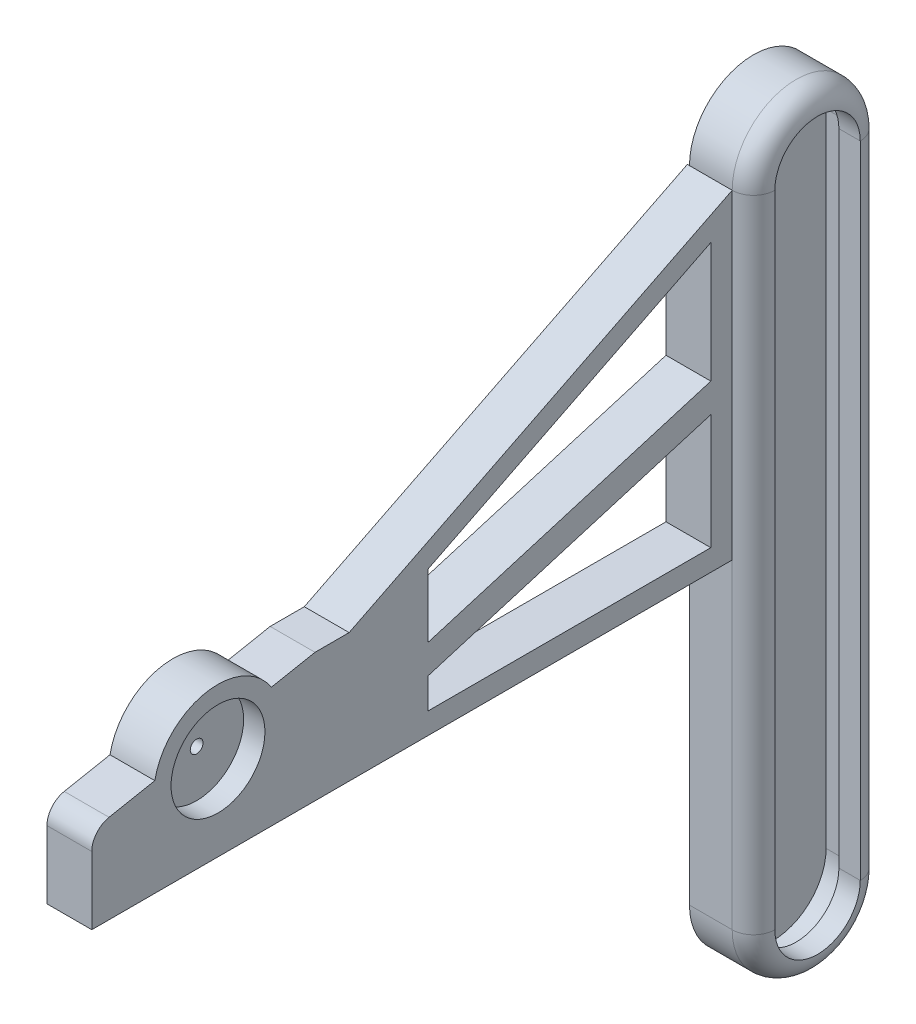
ISO-10303-21;
HEADER;
FILE_DESCRIPTION(('STEP AP214'),'2;1');
FILE_NAME('part.step','',(''),(''),'','','');
FILE_SCHEMA(('AUTOMOTIVE_DESIGN { 1 0 10303 214 1 1 1 1 }'));
ENDSEC;
DATA;
#1=APPLICATION_CONTEXT('core data for automotive mechanical design processes');
#2=APPLICATION_PROTOCOL_DEFINITION('international standard','automotive_design',2000,#1);
#3=PRODUCT_CONTEXT('',#1,'mechanical');
#4=PRODUCT('Part','Part','',(#3));
#5=PRODUCT_RELATED_PRODUCT_CATEGORY('part','',(#4));
#6=PRODUCT_DEFINITION_FORMATION('','',#4);
#7=PRODUCT_DEFINITION_CONTEXT('part definition',#1,'design');
#8=PRODUCT_DEFINITION('design','',#6,#7);
#9=PRODUCT_DEFINITION_SHAPE('','',#8);
#10=(LENGTH_UNIT() NAMED_UNIT(*) SI_UNIT(.MILLI.,.METRE.));
#11=(NAMED_UNIT(*) PLANE_ANGLE_UNIT() SI_UNIT($,.RADIAN.));
#12=(NAMED_UNIT(*) SI_UNIT($,.STERADIAN.) SOLID_ANGLE_UNIT());
#13=UNCERTAINTY_MEASURE_WITH_UNIT(LENGTH_MEASURE(1.E-05),#10,'distance_accuracy_value','');
#14=(GEOMETRIC_REPRESENTATION_CONTEXT(3) GLOBAL_UNCERTAINTY_ASSIGNED_CONTEXT((#13)) GLOBAL_UNIT_ASSIGNED_CONTEXT((#10,
#11,#12)) REPRESENTATION_CONTEXT('',''));
#15=CARTESIAN_POINT('',(0.,0.,0.));
#16=DIRECTION('',(0.,0.,1.));
#17=DIRECTION('',(1.,0.,0.));
#18=AXIS2_PLACEMENT_3D('',#15,#16,#17);
#19=CARTESIAN_POINT('',(20.,189.785242032039,270.87712185161));
#20=DIRECTION('',(-1.,0.,0.));
#21=DIRECTION('',(0.,0.,1.));
#22=AXIS2_PLACEMENT_3D('',#19,#20,#21);
#23=CYLINDRICAL_SURFACE('',#22,2.99999999999999);
#24=CARTESIAN_POINT('',(-0.999999999999987,189.785242032039,270.87712185161));
#25=DIRECTION('',(-1.,0.,0.));
#26=DIRECTION('',(0.,0.,1.));
#27=AXIS2_PLACEMENT_3D('',#24,#25,#26);
#28=CIRCLE('',#27,2.99999999999999);
#29=CARTESIAN_POINT('',(-0.999999999999987,189.785242032039,273.87712185161));
#30=VERTEX_POINT('',#29);
#31=EDGE_CURVE('E246',#30,#30,#28,.T.);
#32=ORIENTED_EDGE('',*,*,#31,.T.);
#33=EDGE_LOOP('',(#32));
#34=FACE_BOUND('',#33,.T.);
#35=CARTESIAN_POINT('',(9.99999999999996,189.785242032039,270.87712185161));
#36=DIRECTION('',(1.,0.,0.));
#37=DIRECTION('',(0.,0.,-1.));
#38=AXIS2_PLACEMENT_3D('',#35,#36,#37);
#39=CIRCLE('',#38,2.99999999999999);
#40=CARTESIAN_POINT('',(9.99999999999996,189.785242032039,267.87712185161));
#41=VERTEX_POINT('',#40);
#42=EDGE_CURVE('E47',#41,#41,#39,.F.);
#43=ORIENTED_EDGE('',*,*,#42,.F.);
#44=EDGE_LOOP('',(#43));
#45=FACE_BOUND('',#44,.T.);
#46=ADVANCED_FACE('F43',(#34,#45),#23,.F.);
#47=CARTESIAN_POINT('',(30.,300.,30.));
#48=DIRECTION('',(0.,0.,-1.));
#49=DIRECTION('',(0.,1.,0.));
#50=AXIS2_PLACEMENT_3D('',#47,#48,#49);
#51=PLANE('',#50);
#52=DIRECTION('',(1.,0.,0.));
#53=VECTOR('',#52,1.);
#54=CARTESIAN_POINT('',(-0.999999999999987,150.,30.));
#55=LINE('',#54,#53);
#56=CARTESIAN_POINT('',(0.,150.,30.));
#57=VERTEX_POINT('',#56);
#58=CARTESIAN_POINT('',(20.,150.,30.));
#59=VERTEX_POINT('',#58);
#60=EDGE_CURVE('E396',#57,#59,#55,.T.);
#61=ORIENTED_EDGE('',*,*,#60,.F.);
#62=DIRECTION('',(0.,-1.,0.));
#63=VECTOR('',#62,1.);
#64=CARTESIAN_POINT('',(0.,300.,30.));
#65=LINE('',#64,#63);
#66=CARTESIAN_POINT('',(0.,0.,30.));
#67=VERTEX_POINT('',#66);
#68=EDGE_CURVE('E497',#57,#67,#65,.T.);
#69=ORIENTED_EDGE('',*,*,#68,.T.);
#70=DIRECTION('',(-1.,0.,0.));
#71=VECTOR('',#70,1.);
#72=CARTESIAN_POINT('',(30.,0.,30.));
#73=LINE('',#72,#71);
#74=CARTESIAN_POINT('',(20.,0.,30.));
#75=VERTEX_POINT('',#74);
#76=EDGE_CURVE('E516',#75,#67,#73,.T.);
#77=ORIENTED_EDGE('',*,*,#76,.F.);
#78=DIRECTION('',(0.,-1.,0.));
#79=VECTOR('',#78,1.);
#80=CARTESIAN_POINT('',(20.,300.,30.));
#81=LINE('',#80,#79);
#82=EDGE_CURVE('E531',#75,#59,#81,.F.);
#83=ORIENTED_EDGE('',*,*,#82,.T.);
#84=EDGE_LOOP('',(#61,#69,#77,#83));
#85=FACE_BOUND('',#84,.T.);
#86=ADVANCED_FACE('F620',(#85),#51,.F.);
#87=CARTESIAN_POINT('',(30.,300.,0.));
#88=DIRECTION('',(-1.,0.,0.));
#89=DIRECTION('',(0.,0.,1.));
#90=AXIS2_PLACEMENT_3D('',#87,#88,#89);
#91=CYLINDRICAL_SURFACE('',#90,30.);
#92=DIRECTION('',(-1.,0.,0.));
#93=VECTOR('',#92,1.);
#94=CARTESIAN_POINT('',(30.,300.,30.));
#95=LINE('',#94,#93);
#96=CARTESIAN_POINT('',(20.,300.,30.));
#97=VERTEX_POINT('',#96);
#98=CARTESIAN_POINT('',(0.,300.,30.));
#99=VERTEX_POINT('',#98);
#100=EDGE_CURVE('E520',#97,#99,#95,.T.);
#101=ORIENTED_EDGE('',*,*,#100,.F.);
#102=CARTESIAN_POINT('',(20.,300.,0.));
#103=DIRECTION('',(1.,0.,0.));
#104=DIRECTION('',(0.,0.,-1.));
#105=AXIS2_PLACEMENT_3D('',#102,#103,#104);
#106=CIRCLE('',#105,30.);
#107=CARTESIAN_POINT('',(20.,300.,-30.));
#108=VERTEX_POINT('',#107);
#109=EDGE_CURVE('E538',#97,#108,#106,.F.);
#110=ORIENTED_EDGE('',*,*,#109,.T.);
#111=DIRECTION('',(-1.,0.,0.));
#112=VECTOR('',#111,1.);
#113=CARTESIAN_POINT('',(30.,300.,-30.));
#114=LINE('',#113,#112);
#115=CARTESIAN_POINT('',(0.,300.,-30.));
#116=VERTEX_POINT('',#115);
#117=EDGE_CURVE('E510',#108,#116,#114,.T.);
#118=ORIENTED_EDGE('',*,*,#117,.T.);
#119=CARTESIAN_POINT('',(0.,300.,0.));
#120=DIRECTION('',(1.,0.,0.));
#121=DIRECTION('',(0.,0.,-1.));
#122=AXIS2_PLACEMENT_3D('',#119,#120,#121);
#123=CIRCLE('',#122,30.);
#124=EDGE_CURVE('E493',#116,#99,#123,.T.);
#125=ORIENTED_EDGE('',*,*,#124,.T.);
#126=EDGE_LOOP('',(#101,#110,#118,#125));
#127=FACE_BOUND('',#126,.T.);
#128=ADVANCED_FACE('F589',(#127),#91,.T.);
#129=CARTESIAN_POINT('',(30.,0.,0.));
#130=DIRECTION('',(-1.,0.,0.));
#131=DIRECTION('',(0.,0.,1.));
#132=AXIS2_PLACEMENT_3D('',#129,#130,#131);
#133=CYLINDRICAL_SURFACE('',#132,30.);
#134=DIRECTION('',(-1.,0.,0.));
#135=VECTOR('',#134,1.);
#136=CARTESIAN_POINT('',(30.,0.,-30.));
#137=LINE('',#136,#135);
#138=CARTESIAN_POINT('',(20.,0.,-30.));
#139=VERTEX_POINT('',#138);
#140=CARTESIAN_POINT('',(0.,0.,-30.));
#141=VERTEX_POINT('',#140);
#142=EDGE_CURVE('E513',#139,#141,#137,.T.);
#143=ORIENTED_EDGE('',*,*,#142,.F.);
#144=CARTESIAN_POINT('',(20.,0.,0.));
#145=DIRECTION('',(1.,0.,0.));
#146=DIRECTION('',(0.,0.,-1.));
#147=AXIS2_PLACEMENT_3D('',#144,#145,#146);
#148=CIRCLE('',#147,30.);
#149=EDGE_CURVE('E527',#139,#75,#148,.F.);
#150=ORIENTED_EDGE('',*,*,#149,.T.);
#151=ORIENTED_EDGE('',*,*,#76,.T.);
#152=CARTESIAN_POINT('',(0.,0.,0.));
#153=DIRECTION('',(1.,0.,0.));
#154=DIRECTION('',(0.,0.,-1.));
#155=AXIS2_PLACEMENT_3D('',#152,#153,#154);
#156=CIRCLE('',#155,30.);
#157=EDGE_CURVE('E502',#67,#141,#156,.T.);
#158=ORIENTED_EDGE('',*,*,#157,.T.);
#159=EDGE_LOOP('',(#143,#150,#151,#158));
#160=FACE_BOUND('',#159,.T.);
#161=ADVANCED_FACE('F1035',(#160),#133,.T.);
#162=CARTESIAN_POINT('',(30.,0.,-30.));
#163=DIRECTION('',(0.,0.,1.));
#164=DIRECTION('',(0.,-1.,0.));
#165=AXIS2_PLACEMENT_3D('',#162,#163,#164);
#166=PLANE('',#165);
#167=ORIENTED_EDGE('',*,*,#117,.F.);
#168=DIRECTION('',(0.,1.,0.));
#169=VECTOR('',#168,1.);
#170=CARTESIAN_POINT('',(20.,0.,-30.));
#171=LINE('',#170,#169);
#172=EDGE_CURVE('E535',#108,#139,#171,.F.);
#173=ORIENTED_EDGE('',*,*,#172,.T.);
#174=ORIENTED_EDGE('',*,*,#142,.T.);
#175=DIRECTION('',(0.,1.,0.));
#176=VECTOR('',#175,1.);
#177=CARTESIAN_POINT('',(0.,0.,-30.));
#178=LINE('',#177,#176);
#179=EDGE_CURVE('E506',#141,#116,#178,.T.);
#180=ORIENTED_EDGE('',*,*,#179,.T.);
#181=EDGE_LOOP('',(#167,#173,#174,#180));
#182=FACE_BOUND('',#181,.T.);
#183=ADVANCED_FACE('F1025',(#182),#166,.F.);
#184=CARTESIAN_POINT('',(30.,0.,0.));
#185=DIRECTION('',(-1.,0.,0.));
#186=DIRECTION('',(0.,0.,1.));
#187=AXIS2_PLACEMENT_3D('',#184,#185,#186);
#188=CYLINDRICAL_SURFACE('',#187,20.);
#189=CARTESIAN_POINT('',(20.,0.,0.));
#190=DIRECTION('',(1.,0.,0.));
#191=DIRECTION('',(0.,0.,-1.));
#192=AXIS2_PLACEMENT_3D('',#189,#190,#191);
#193=CIRCLE('',#192,20.);
#194=CARTESIAN_POINT('',(20.,0.,20.));
#195=VERTEX_POINT('',#194);
#196=CARTESIAN_POINT('',(20.,0.,-20.));
#197=VERTEX_POINT('',#196);
#198=EDGE_CURVE('E460',#195,#197,#193,.T.);
#199=ORIENTED_EDGE('',*,*,#198,.F.);
#200=DIRECTION('',(-1.,0.,0.));
#201=VECTOR('',#200,1.);
#202=CARTESIAN_POINT('',(30.,0.,20.));
#203=LINE('',#202,#201);
#204=CARTESIAN_POINT('',(30.,0.,20.));
#205=VERTEX_POINT('',#204);
#206=EDGE_CURVE('E477',#205,#195,#203,.T.);
#207=ORIENTED_EDGE('',*,*,#206,.F.);
#208=CARTESIAN_POINT('',(30.,0.,0.));
#209=DIRECTION('',(1.,0.,0.));
#210=DIRECTION('',(0.,0.,-1.));
#211=AXIS2_PLACEMENT_3D('',#208,#209,#210);
#212=CIRCLE('',#211,20.);
#213=CARTESIAN_POINT('',(30.,0.,-20.));
#214=VERTEX_POINT('',#213);
#215=EDGE_CURVE('E463',#205,#214,#212,.T.);
#216=ORIENTED_EDGE('',*,*,#215,.T.);
#217=DIRECTION('',(-1.,0.,0.));
#218=VECTOR('',#217,1.);
#219=CARTESIAN_POINT('',(30.,0.,-20.));
#220=LINE('',#219,#218);
#221=EDGE_CURVE('E489',#214,#197,#220,.T.);
#222=ORIENTED_EDGE('',*,*,#221,.T.);
#223=EDGE_LOOP('',(#199,#207,#216,#222));
#224=FACE_BOUND('',#223,.T.);
#225=ADVANCED_FACE('F1015',(#224),#188,.F.);
#226=CARTESIAN_POINT('',(30.,300.,-20.));
#227=DIRECTION('',(0.,0.,1.));
#228=DIRECTION('',(0.,-1.,0.));
#229=AXIS2_PLACEMENT_3D('',#226,#227,#228);
#230=PLANE('',#229);
#231=DIRECTION('',(0.,1.,0.));
#232=VECTOR('',#231,1.);
#233=CARTESIAN_POINT('',(20.,300.,-20.));
#234=LINE('',#233,#232);
#235=CARTESIAN_POINT('',(20.,300.,-20.));
#236=VERTEX_POINT('',#235);
#237=EDGE_CURVE('E457',#197,#236,#234,.T.);
#238=ORIENTED_EDGE('',*,*,#237,.F.);
#239=ORIENTED_EDGE('',*,*,#221,.F.);
#240=DIRECTION('',(0.,1.,0.));
#241=VECTOR('',#240,1.);
#242=CARTESIAN_POINT('',(30.,300.,-20.));
#243=LINE('',#242,#241);
#244=CARTESIAN_POINT('',(30.,300.,-20.));
#245=VERTEX_POINT('',#244);
#246=EDGE_CURVE('E467',#214,#245,#243,.T.);
#247=ORIENTED_EDGE('',*,*,#246,.T.);
#248=DIRECTION('',(-1.,0.,0.));
#249=VECTOR('',#248,1.);
#250=CARTESIAN_POINT('',(30.,300.,-20.));
#251=LINE('',#250,#249);
#252=EDGE_CURVE('E485',#245,#236,#251,.T.);
#253=ORIENTED_EDGE('',*,*,#252,.T.);
#254=EDGE_LOOP('',(#238,#239,#247,#253));
#255=FACE_BOUND('',#254,.T.);
#256=ADVANCED_FACE('F1005',(#255),#230,.T.);
#257=CARTESIAN_POINT('',(30.,300.,0.));
#258=DIRECTION('',(-1.,0.,0.));
#259=DIRECTION('',(0.,0.,1.));
#260=AXIS2_PLACEMENT_3D('',#257,#258,#259);
#261=CYLINDRICAL_SURFACE('',#260,20.);
#262=CARTESIAN_POINT('',(20.,300.,0.));
#263=DIRECTION('',(1.,0.,0.));
#264=DIRECTION('',(0.,0.,-1.));
#265=AXIS2_PLACEMENT_3D('',#262,#263,#264);
#266=CIRCLE('',#265,20.);
#267=CARTESIAN_POINT('',(20.,300.,20.));
#268=VERTEX_POINT('',#267);
#269=EDGE_CURVE('E446',#236,#268,#266,.T.);
#270=ORIENTED_EDGE('',*,*,#269,.F.);
#271=ORIENTED_EDGE('',*,*,#252,.F.);
#272=CARTESIAN_POINT('',(30.,300.,0.));
#273=DIRECTION('',(1.,0.,0.));
#274=DIRECTION('',(0.,0.,-1.));
#275=AXIS2_PLACEMENT_3D('',#272,#273,#274);
#276=CIRCLE('',#275,20.);
#277=CARTESIAN_POINT('',(30.,300.,20.));
#278=VERTEX_POINT('',#277);
#279=EDGE_CURVE('E470',#245,#278,#276,.T.);
#280=ORIENTED_EDGE('',*,*,#279,.T.);
#281=DIRECTION('',(-1.,0.,0.));
#282=VECTOR('',#281,1.);
#283=CARTESIAN_POINT('',(30.,300.,20.));
#284=LINE('',#283,#282);
#285=EDGE_CURVE('E481',#278,#268,#284,.T.);
#286=ORIENTED_EDGE('',*,*,#285,.T.);
#287=EDGE_LOOP('',(#270,#271,#280,#286));
#288=FACE_BOUND('',#287,.T.);
#289=ADVANCED_FACE('F995',(#288),#261,.F.);
#290=CARTESIAN_POINT('',(30.,0.,20.));
#291=DIRECTION('',(0.,0.,-1.));
#292=DIRECTION('',(0.,1.,0.));
#293=AXIS2_PLACEMENT_3D('',#290,#291,#292);
#294=PLANE('',#293);
#295=DIRECTION('',(0.,-1.,0.));
#296=VECTOR('',#295,1.);
#297=CARTESIAN_POINT('',(20.,0.,20.));
#298=LINE('',#297,#296);
#299=EDGE_CURVE('E524',#268,#195,#298,.T.);
#300=ORIENTED_EDGE('',*,*,#299,.F.);
#301=ORIENTED_EDGE('',*,*,#285,.F.);
#302=DIRECTION('',(0.,-1.,0.));
#303=VECTOR('',#302,1.);
#304=CARTESIAN_POINT('',(30.,0.,20.));
#305=LINE('',#304,#303);
#306=EDGE_CURVE('E474',#278,#205,#305,.T.);
#307=ORIENTED_EDGE('',*,*,#306,.T.);
#308=ORIENTED_EDGE('',*,*,#206,.T.);
#309=EDGE_LOOP('',(#300,#301,#307,#308));
#310=FACE_BOUND('',#309,.T.);
#311=ADVANCED_FACE('F990',(#310),#294,.T.);
#312=CARTESIAN_POINT('',(0.,0.,0.));
#313=DIRECTION('',(1.,0.,0.));
#314=DIRECTION('',(0.,0.,-1.));
#315=AXIS2_PLACEMENT_3D('',#312,#313,#314);
#316=PLANE('',#315);
#317=ORIENTED_EDGE('',*,*,#124,.F.);
#318=ORIENTED_EDGE('',*,*,#179,.F.);
#319=ORIENTED_EDGE('',*,*,#157,.F.);
#320=ORIENTED_EDGE('',*,*,#68,.F.);
#321=EDGE_CURVE('E498',#99,#57,#65,.T.);
#322=ORIENTED_EDGE('',*,*,#321,.F.);
#323=EDGE_LOOP('',(#317,#318,#319,#320,#322));
#324=FACE_BOUND('',#323,.T.);
#325=ADVANCED_FACE('F584',(#324),#316,.F.);
#326=CARTESIAN_POINT('',(9.00000000000001,0.,0.));
#327=DIRECTION('',(1.,0.,0.));
#328=DIRECTION('',(0.,0.,-1.));
#329=AXIS2_PLACEMENT_3D('',#326,#327,#328);
#330=CYLINDRICAL_SURFACE('',#329,25.);
#331=DIRECTION('',(1.,0.,0.));
#332=VECTOR('',#331,1.);
#333=CARTESIAN_POINT('',(9.00000000000001,0.,-25.));
#334=LINE('',#333,#332);
#335=CARTESIAN_POINT('',(9.00000000000001,0.,-25.));
#336=VERTEX_POINT('',#335);
#337=CARTESIAN_POINT('',(20.,0.,-25.));
#338=VERTEX_POINT('',#337);
#339=EDGE_CURVE('E442',#336,#338,#334,.T.);
#340=ORIENTED_EDGE('',*,*,#339,.F.);
#341=CARTESIAN_POINT('',(9.00000000000001,0.,0.));
#342=DIRECTION('',(1.,0.,0.));
#343=DIRECTION('',(0.,0.,-1.));
#344=AXIS2_PLACEMENT_3D('',#341,#342,#343);
#345=CIRCLE('',#344,25.);
#346=CARTESIAN_POINT('',(9.00000000000001,0.,25.));
#347=VERTEX_POINT('',#346);
#348=EDGE_CURVE('E426',#347,#336,#345,.T.);
#349=ORIENTED_EDGE('',*,*,#348,.F.);
#350=DIRECTION('',(1.,0.,0.));
#351=VECTOR('',#350,1.);
#352=CARTESIAN_POINT('',(9.00000000000001,0.,25.));
#353=LINE('',#352,#351);
#354=CARTESIAN_POINT('',(20.,0.,25.));
#355=VERTEX_POINT('',#354);
#356=EDGE_CURVE('E443',#347,#355,#353,.T.);
#357=ORIENTED_EDGE('',*,*,#356,.T.);
#358=CARTESIAN_POINT('',(20.,0.,0.));
#359=DIRECTION('',(1.,0.,0.));
#360=DIRECTION('',(0.,0.,-1.));
#361=AXIS2_PLACEMENT_3D('',#358,#359,#360);
#362=CIRCLE('',#361,25.);
#363=EDGE_CURVE('E409',#355,#338,#362,.T.);
#364=ORIENTED_EDGE('',*,*,#363,.T.);
#365=EDGE_LOOP('',(#340,#349,#357,#364));
#366=FACE_BOUND('',#365,.T.);
#367=ADVANCED_FACE('F974',(#366),#330,.F.);
#368=CARTESIAN_POINT('',(9.00000000000001,0.,25.));
#369=DIRECTION('',(0.,0.,1.));
#370=DIRECTION('',(0.,-1.,0.));
#371=AXIS2_PLACEMENT_3D('',#368,#369,#370);
#372=PLANE('',#371);
#373=ORIENTED_EDGE('',*,*,#356,.F.);
#374=DIRECTION('',(0.,-1.,0.));
#375=VECTOR('',#374,1.);
#376=CARTESIAN_POINT('',(9.00000000000001,0.,25.));
#377=LINE('',#376,#375);
#378=CARTESIAN_POINT('',(9.00000000000001,300.,25.));
#379=VERTEX_POINT('',#378);
#380=EDGE_CURVE('E438',#379,#347,#377,.T.);
#381=ORIENTED_EDGE('',*,*,#380,.F.);
#382=DIRECTION('',(1.,0.,0.));
#383=VECTOR('',#382,1.);
#384=CARTESIAN_POINT('',(9.00000000000001,300.,25.));
#385=LINE('',#384,#383);
#386=CARTESIAN_POINT('',(20.,300.,25.));
#387=VERTEX_POINT('',#386);
#388=EDGE_CURVE('E447',#379,#387,#385,.T.);
#389=ORIENTED_EDGE('',*,*,#388,.T.);
#390=DIRECTION('',(0.,-1.,0.));
#391=VECTOR('',#390,1.);
#392=CARTESIAN_POINT('',(20.,0.,25.));
#393=LINE('',#392,#391);
#394=EDGE_CURVE('E422',#387,#355,#393,.T.);
#395=ORIENTED_EDGE('',*,*,#394,.T.);
#396=EDGE_LOOP('',(#373,#381,#389,#395));
#397=FACE_BOUND('',#396,.T.);
#398=ADVANCED_FACE('F964',(#397),#372,.F.);
#399=CARTESIAN_POINT('',(9.00000000000001,300.,0.));
#400=DIRECTION('',(1.,0.,0.));
#401=DIRECTION('',(0.,0.,-1.));
#402=AXIS2_PLACEMENT_3D('',#399,#400,#401);
#403=CYLINDRICAL_SURFACE('',#402,25.);
#404=ORIENTED_EDGE('',*,*,#388,.F.);
#405=CARTESIAN_POINT('',(9.00000000000001,300.,0.));
#406=DIRECTION('',(1.,0.,0.));
#407=DIRECTION('',(0.,0.,-1.));
#408=AXIS2_PLACEMENT_3D('',#405,#406,#407);
#409=CIRCLE('',#408,25.);
#410=CARTESIAN_POINT('',(9.00000000000001,300.,-25.));
#411=VERTEX_POINT('',#410);
#412=EDGE_CURVE('E434',#411,#379,#409,.T.);
#413=ORIENTED_EDGE('',*,*,#412,.F.);
#414=DIRECTION('',(1.,0.,0.));
#415=VECTOR('',#414,1.);
#416=CARTESIAN_POINT('',(9.00000000000001,300.,-25.));
#417=LINE('',#416,#415);
#418=CARTESIAN_POINT('',(20.,300.,-25.));
#419=VERTEX_POINT('',#418);
#420=EDGE_CURVE('E450',#411,#419,#417,.T.);
#421=ORIENTED_EDGE('',*,*,#420,.T.);
#422=CARTESIAN_POINT('',(20.,300.,0.));
#423=DIRECTION('',(1.,0.,0.));
#424=DIRECTION('',(0.,0.,-1.));
#425=AXIS2_PLACEMENT_3D('',#422,#423,#424);
#426=CIRCLE('',#425,25.);
#427=EDGE_CURVE('E418',#419,#387,#426,.T.);
#428=ORIENTED_EDGE('',*,*,#427,.T.);
#429=EDGE_LOOP('',(#404,#413,#421,#428));
#430=FACE_BOUND('',#429,.T.);
#431=ADVANCED_FACE('F954',(#430),#403,.F.);
#432=CARTESIAN_POINT('',(9.00000000000001,300.,-25.));
#433=DIRECTION('',(0.,0.,-1.));
#434=DIRECTION('',(0.,1.,0.));
#435=AXIS2_PLACEMENT_3D('',#432,#433,#434);
#436=PLANE('',#435);
#437=ORIENTED_EDGE('',*,*,#420,.F.);
#438=DIRECTION('',(0.,1.,0.));
#439=VECTOR('',#438,1.);
#440=CARTESIAN_POINT('',(9.00000000000001,300.,-25.));
#441=LINE('',#440,#439);
#442=EDGE_CURVE('E430',#336,#411,#441,.T.);
#443=ORIENTED_EDGE('',*,*,#442,.F.);
#444=ORIENTED_EDGE('',*,*,#339,.T.);
#445=DIRECTION('',(0.,1.,0.));
#446=VECTOR('',#445,1.);
#447=CARTESIAN_POINT('',(20.,300.,-25.));
#448=LINE('',#447,#446);
#449=EDGE_CURVE('E413',#338,#419,#448,.T.);
#450=ORIENTED_EDGE('',*,*,#449,.T.);
#451=EDGE_LOOP('',(#437,#443,#444,#450));
#452=FACE_BOUND('',#451,.T.);
#453=ADVANCED_FACE('F944',(#452),#436,.F.);
#454=CARTESIAN_POINT('',(9.00000000000001,0.,0.));
#455=DIRECTION('',(1.,0.,0.));
#456=DIRECTION('',(0.,0.,-1.));
#457=AXIS2_PLACEMENT_3D('',#454,#455,#456);
#458=PLANE('',#457);
#459=ORIENTED_EDGE('',*,*,#348,.T.);
#460=ORIENTED_EDGE('',*,*,#442,.T.);
#461=ORIENTED_EDGE('',*,*,#412,.T.);
#462=ORIENTED_EDGE('',*,*,#380,.T.);
#463=EDGE_LOOP('',(#459,#460,#461,#462));
#464=FACE_BOUND('',#463,.T.);
#465=ADVANCED_FACE('F934',(#464),#458,.T.);
#466=CARTESIAN_POINT('',(20.,0.,0.));
#467=DIRECTION('',(1.,0.,0.));
#468=DIRECTION('',(0.,0.,-1.));
#469=AXIS2_PLACEMENT_3D('',#466,#467,#468);
#470=PLANE('',#469);
#471=ORIENTED_EDGE('',*,*,#198,.T.);
#472=ORIENTED_EDGE('',*,*,#237,.T.);
#473=ORIENTED_EDGE('',*,*,#269,.T.);
#474=ORIENTED_EDGE('',*,*,#299,.T.);
#475=EDGE_LOOP('',(#471,#472,#473,#474));
#476=FACE_BOUND('',#475,.T.);
#477=ORIENTED_EDGE('',*,*,#363,.F.);
#478=ORIENTED_EDGE('',*,*,#394,.F.);
#479=ORIENTED_EDGE('',*,*,#427,.F.);
#480=ORIENTED_EDGE('',*,*,#449,.F.);
#481=EDGE_LOOP('',(#477,#478,#479,#480));
#482=FACE_BOUND('',#481,.T.);
#483=ADVANCED_FACE('F925',(#476,#482),#470,.F.);
#484=CARTESIAN_POINT('',(20.,300.,0.));
#485=DIRECTION('',(1.,0.,0.));
#486=DIRECTION('',(0.,0.,-1.));
#487=AXIS2_PLACEMENT_3D('',#484,#485,#486);
#488=TOROIDAL_SURFACE('',#487,20.,10.);
#489=CARTESIAN_POINT('',(20.,300.,-20.));
#490=DIRECTION('',(0.,-1.,0.));
#491=DIRECTION('',(0.,0.,-1.));
#492=AXIS2_PLACEMENT_3D('',#489,#490,#491);
#493=CIRCLE('',#492,10.);
#494=EDGE_CURVE('E547',#108,#245,#493,.T.);
#495=ORIENTED_EDGE('',*,*,#494,.F.);
#496=ORIENTED_EDGE('',*,*,#109,.F.);
#497=CARTESIAN_POINT('',(20.,300.,20.));
#498=DIRECTION('',(0.,-1.,0.));
#499=DIRECTION('',(0.,0.,-1.));
#500=AXIS2_PLACEMENT_3D('',#497,#498,#499);
#501=CIRCLE('',#500,10.);
#502=EDGE_CURVE('E414',#278,#97,#501,.T.);
#503=ORIENTED_EDGE('',*,*,#502,.F.);
#504=ORIENTED_EDGE('',*,*,#279,.F.);
#505=EDGE_LOOP('',(#495,#496,#503,#504));
#506=FACE_BOUND('',#505,.T.);
#507=ADVANCED_FACE('F915',(#506),#488,.T.);
#508=CARTESIAN_POINT('',(20.,300.,20.));
#509=DIRECTION('',(0.,1.,0.));
#510=DIRECTION('',(0.,0.,1.));
#511=AXIS2_PLACEMENT_3D('',#508,#509,#510);
#512=CYLINDRICAL_SURFACE('',#511,10.);
#513=ORIENTED_EDGE('',*,*,#502,.T.);
#514=DIRECTION('',(0.,-1.,0.));
#515=VECTOR('',#514,1.);
#516=CARTESIAN_POINT('',(20.,300.,30.));
#517=LINE('',#516,#515);
#518=EDGE_CURVE('E378',#97,#59,#517,.T.);
#519=ORIENTED_EDGE('',*,*,#518,.T.);
#520=ORIENTED_EDGE('',*,*,#82,.F.);
#521=CARTESIAN_POINT('',(20.,0.,20.));
#522=DIRECTION('',(0.,-1.,0.));
#523=DIRECTION('',(0.,0.,-1.));
#524=AXIS2_PLACEMENT_3D('',#521,#522,#523);
#525=CIRCLE('',#524,10.);
#526=EDGE_CURVE('E544',#205,#75,#525,.T.);
#527=ORIENTED_EDGE('',*,*,#526,.F.);
#528=ORIENTED_EDGE('',*,*,#306,.F.);
#529=EDGE_LOOP('',(#513,#519,#520,#527,#528));
#530=FACE_BOUND('',#529,.T.);
#531=ADVANCED_FACE('F905',(#530),#512,.T.);
#532=CARTESIAN_POINT('',(20.,300.,-20.));
#533=DIRECTION('',(0.,-1.,0.));
#534=DIRECTION('',(0.,0.,-1.));
#535=AXIS2_PLACEMENT_3D('',#532,#533,#534);
#536=CYLINDRICAL_SURFACE('',#535,10.);
#537=ORIENTED_EDGE('',*,*,#494,.T.);
#538=ORIENTED_EDGE('',*,*,#246,.F.);
#539=CARTESIAN_POINT('',(20.,0.,-20.));
#540=DIRECTION('',(0.,-1.,0.));
#541=DIRECTION('',(0.,0.,-1.));
#542=AXIS2_PLACEMENT_3D('',#539,#540,#541);
#543=CIRCLE('',#542,10.);
#544=EDGE_CURVE('E387',#139,#214,#543,.T.);
#545=ORIENTED_EDGE('',*,*,#544,.F.);
#546=ORIENTED_EDGE('',*,*,#172,.F.);
#547=EDGE_LOOP('',(#537,#538,#545,#546));
#548=FACE_BOUND('',#547,.T.);
#549=ADVANCED_FACE('F896',(#548),#536,.T.);
#550=CARTESIAN_POINT('',(20.,0.,0.));
#551=DIRECTION('',(1.,0.,0.));
#552=DIRECTION('',(0.,0.,-1.));
#553=AXIS2_PLACEMENT_3D('',#550,#551,#552);
#554=TOROIDAL_SURFACE('',#553,20.,10.);
#555=ORIENTED_EDGE('',*,*,#526,.T.);
#556=ORIENTED_EDGE('',*,*,#149,.F.);
#557=ORIENTED_EDGE('',*,*,#544,.T.);
#558=ORIENTED_EDGE('',*,*,#215,.F.);
#559=EDGE_LOOP('',(#555,#556,#557,#558));
#560=FACE_BOUND('',#559,.T.);
#561=ADVANCED_FACE('F671',(#560),#554,.T.);
#562=CARTESIAN_POINT('',(-0.999999999999987,300.,30.));
#563=DIRECTION('',(0.,0.,1.));
#564=DIRECTION('',(0.,-1.,0.));
#565=AXIS2_PLACEMENT_3D('',#562,#563,#564);
#566=PLANE('',#565);
#567=DIRECTION('',(1.,0.,0.));
#568=VECTOR('',#567,1.);
#569=CARTESIAN_POINT('',(-0.999999999999987,300.,30.));
#570=LINE('',#569,#568);
#571=CARTESIAN_POINT('',(-0.999999999999987,300.,30.));
#572=VERTEX_POINT('',#571);
#573=EDGE_CURVE('E388',#572,#99,#570,.T.);
#574=ORIENTED_EDGE('',*,*,#573,.T.);
#575=ORIENTED_EDGE('',*,*,#321,.T.);
#576=CARTESIAN_POINT('',(-0.999999999999987,150.,30.));
#577=VERTEX_POINT('',#576);
#578=EDGE_CURVE('E392',#577,#57,#55,.T.);
#579=ORIENTED_EDGE('',*,*,#578,.F.);
#580=DIRECTION('',(0.,-1.,0.));
#581=VECTOR('',#580,1.);
#582=CARTESIAN_POINT('',(-0.999999999999987,300.,30.));
#583=LINE('',#582,#581);
#584=EDGE_CURVE('E350',#572,#577,#583,.T.);
#585=ORIENTED_EDGE('',*,*,#584,.F.);
#586=EDGE_LOOP('',(#574,#575,#579,#585));
#587=FACE_BOUND('',#586,.T.);
#588=ADVANCED_FACE('F581',(#587),#566,.F.);
#589=CARTESIAN_POINT('',(-0.999999999999987,210.277298245187,209.445403509626));
#590=DIRECTION('',(0.,1.,0.));
#591=DIRECTION('',(0.,0.,1.));
#592=AXIS2_PLACEMENT_3D('',#589,#590,#591);
#593=PLANE('',#592);
#594=DIRECTION('',(0.,0.,1.));
#595=VECTOR('',#594,1.);
#596=CARTESIAN_POINT('',(20.,210.277298245187,209.445403509626));
#597=LINE('',#596,#595);
#598=CARTESIAN_POINT('',(20.,210.277298245187,209.445403509626));
#599=VERTEX_POINT('',#598);
#600=CARTESIAN_POINT('',(20.,210.277298245187,225.445403509626));
#601=VERTEX_POINT('',#600);
#602=EDGE_CURVE('E317',#599,#601,#597,.T.);
#603=ORIENTED_EDGE('',*,*,#602,.F.);
#604=DIRECTION('',(1.,0.,0.));
#605=VECTOR('',#604,1.);
#606=CARTESIAN_POINT('',(-0.999999999999987,210.277298245187,209.445403509626));
#607=LINE('',#606,#605);
#608=CARTESIAN_POINT('',(-0.999999999999987,210.277298245187,209.445403509626));
#609=VERTEX_POINT('',#608);
#610=EDGE_CURVE('E384',#609,#599,#607,.T.);
#611=ORIENTED_EDGE('',*,*,#610,.F.);
#612=DIRECTION('',(0.,0.,1.));
#613=VECTOR('',#612,1.);
#614=CARTESIAN_POINT('',(-0.999999999999987,210.277298245187,209.445403509626));
#615=LINE('',#614,#613);
#616=CARTESIAN_POINT('',(-0.999999999999987,210.277298245187,225.445403509626));
#617=VERTEX_POINT('',#616);
#618=EDGE_CURVE('E327',#609,#617,#615,.T.);
#619=ORIENTED_EDGE('',*,*,#618,.T.);
#620=DIRECTION('',(1.,0.,0.));
#621=VECTOR('',#620,1.);
#622=CARTESIAN_POINT('',(-0.999999999999987,210.277298245187,225.445403509626));
#623=LINE('',#622,#621);
#624=EDGE_CURVE('E356',#617,#601,#623,.T.);
#625=ORIENTED_EDGE('',*,*,#624,.T.);
#626=EDGE_LOOP('',(#603,#611,#619,#625));
#627=FACE_BOUND('',#626,.T.);
#628=ADVANCED_FACE('F595',(#627),#593,.T.);
#629=CARTESIAN_POINT('',(-0.999999999999987,210.277298245187,209.445403509626));
#630=DIRECTION('',(0.,-0.894427190999916,-0.447213595499958));
#631=DIRECTION('',(0.,0.447213595499958,-0.894427190999916));
#632=AXIS2_PLACEMENT_3D('',#629,#630,#631);
#633=PLANE('',#632);
#634=DIRECTION('',(0.,0.447213595499958,-0.894427190999916));
#635=VECTOR('',#634,1.);
#636=CARTESIAN_POINT('',(20.,210.277298245187,209.445403509626));
#637=LINE('',#636,#635);
#638=EDGE_CURVE('E332',#599,#97,#637,.T.);
#639=ORIENTED_EDGE('',*,*,#638,.T.);
#640=ORIENTED_EDGE('',*,*,#100,.T.);
#641=ORIENTED_EDGE('',*,*,#573,.F.);
#642=DIRECTION('',(0.,0.447213595499958,-0.894427190999916));
#643=VECTOR('',#642,1.);
#644=CARTESIAN_POINT('',(-0.999999999999987,210.277298245187,209.445403509626));
#645=LINE('',#644,#643);
#646=EDGE_CURVE('E353',#609,#572,#645,.T.);
#647=ORIENTED_EDGE('',*,*,#646,.F.);
#648=ORIENTED_EDGE('',*,*,#610,.T.);
#649=EDGE_LOOP('',(#639,#640,#641,#647,#648));
#650=FACE_BOUND('',#649,.T.);
#651=ADVANCED_FACE('F592',(#650),#633,.F.);
#652=CARTESIAN_POINT('',(-0.999999999999987,150.,30.));
#653=DIRECTION('',(0.,1.,0.));
#654=DIRECTION('',(0.,0.,1.));
#655=AXIS2_PLACEMENT_3D('',#652,#653,#654);
#656=PLANE('',#655);
#657=DIRECTION('',(0.,0.,1.));
#658=VECTOR('',#657,1.);
#659=CARTESIAN_POINT('',(20.,150.,30.));
#660=LINE('',#659,#658);
#661=CARTESIAN_POINT('',(20.,150.,330.));
#662=VERTEX_POINT('',#661);
#663=EDGE_CURVE('E374',#59,#662,#660,.T.);
#664=ORIENTED_EDGE('',*,*,#663,.T.);
#665=DIRECTION('',(1.,0.,0.));
#666=VECTOR('',#665,1.);
#667=CARTESIAN_POINT('',(-0.999999999999987,150.,330.));
#668=LINE('',#667,#666);
#669=CARTESIAN_POINT('',(-0.999999999999987,150.,330.));
#670=VERTEX_POINT('',#669);
#671=EDGE_CURVE('E397',#670,#662,#668,.T.);
#672=ORIENTED_EDGE('',*,*,#671,.F.);
#673=DIRECTION('',(0.,0.,1.));
#674=VECTOR('',#673,1.);
#675=CARTESIAN_POINT('',(-0.999999999999987,150.,30.));
#676=LINE('',#675,#674);
#677=EDGE_CURVE('E346',#577,#670,#676,.T.);
#678=ORIENTED_EDGE('',*,*,#677,.F.);
#679=ORIENTED_EDGE('',*,*,#578,.T.);
#680=ORIENTED_EDGE('',*,*,#60,.T.);
#681=EDGE_LOOP('',(#664,#672,#678,#679,#680));
#682=FACE_BOUND('',#681,.T.);
#683=ADVANCED_FACE('F564',(#682),#656,.F.);
#684=CARTESIAN_POINT('',(-0.999999999999987,190.,330.));
#685=DIRECTION('',(0.,0.,1.));
#686=DIRECTION('',(1.,0.,0.));
#687=AXIS2_PLACEMENT_3D('',#684,#685,#686);
#688=PLANE('',#687);
#689=DIRECTION('',(0.,-1.,0.));
#690=VECTOR('',#689,1.);
#691=CARTESIAN_POINT('',(20.,190.,330.));
#692=LINE('',#691,#690);
#693=CARTESIAN_POINT('',(20.,181.753070718885,330.));
#694=VERTEX_POINT('',#693);
#695=EDGE_CURVE('E371',#694,#662,#692,.T.);
#696=ORIENTED_EDGE('',*,*,#695,.F.);
#697=DIRECTION('',(1.,0.,0.));
#698=VECTOR('',#697,1.);
#699=CARTESIAN_POINT('',(-0.999999999999987,181.753070718885,330.));
#700=LINE('',#699,#698);
#701=CARTESIAN_POINT('',(-0.999999999999987,181.753070718885,330.));
#702=VERTEX_POINT('',#701);
#703=EDGE_CURVE('E53',#694,#702,#700,.F.);
#704=ORIENTED_EDGE('',*,*,#703,.T.);
#705=DIRECTION('',(0.,-1.,0.));
#706=VECTOR('',#705,1.);
#707=CARTESIAN_POINT('',(-0.999999999999987,190.,330.));
#708=LINE('',#707,#706);
#709=EDGE_CURVE('E343',#702,#670,#708,.T.);
#710=ORIENTED_EDGE('',*,*,#709,.T.);
#711=ORIENTED_EDGE('',*,*,#671,.T.);
#712=EDGE_LOOP('',(#696,#704,#710,#711));
#713=FACE_BOUND('',#712,.T.);
#714=ADVANCED_FACE('F572',(#713),#688,.T.);
#715=CARTESIAN_POINT('',(-0.999999999999987,195.725852299556,300.476136933791));
#716=DIRECTION('',(0.,0.981708093319838,0.19039227796927));
#717=DIRECTION('',(0.,-0.19039227796927,0.981708093319838));
#718=AXIS2_PLACEMENT_3D('',#715,#716,#717);
#719=PLANE('',#718);
#720=DIRECTION('',(0.,-0.190392277969269,0.981708093319838));
#721=VECTOR('',#720,1.);
#722=CARTESIAN_POINT('',(-0.999999999999987,195.725852299556,300.476136933791));
#723=LINE('',#722,#721);
#724=CARTESIAN_POINT('',(-0.999999999999987,195.725852299556,300.476136933791));
#725=VERTEX_POINT('',#724);
#726=CARTESIAN_POINT('',(-0.999999999999987,191.570151652083,321.903922779693));
#727=VERTEX_POINT('',#726);
#728=EDGE_CURVE('E339',#725,#727,#723,.T.);
#729=ORIENTED_EDGE('',*,*,#728,.T.);
#730=DIRECTION('',(1.,0.,0.));
#731=VECTOR('',#730,1.);
#732=CARTESIAN_POINT('',(-0.999999999999987,191.570151652083,321.903922779693));
#733=LINE('',#732,#731);
#734=CARTESIAN_POINT('',(20.,191.570151652083,321.903922779693));
#735=VERTEX_POINT('',#734);
#736=EDGE_CURVE('E541',#727,#735,#733,.T.);
#737=ORIENTED_EDGE('',*,*,#736,.T.);
#738=DIRECTION('',(0.,-0.190392277969269,0.981708093319838));
#739=VECTOR('',#738,1.);
#740=CARTESIAN_POINT('',(20.,195.725852299556,300.476136933791));
#741=LINE('',#740,#739);
#742=CARTESIAN_POINT('',(20.,195.725852299556,300.476136933791));
#743=VERTEX_POINT('',#742);
#744=EDGE_CURVE('E368',#743,#735,#741,.T.);
#745=ORIENTED_EDGE('',*,*,#744,.F.);
#746=DIRECTION('',(1.,0.,0.));
#747=VECTOR('',#746,1.);
#748=CARTESIAN_POINT('',(-0.999999999999987,195.725852299556,300.476136933791));
#749=LINE('',#748,#747);
#750=EDGE_CURVE('E401',#725,#743,#749,.T.);
#751=ORIENTED_EDGE('',*,*,#750,.F.);
#752=EDGE_LOOP('',(#729,#737,#745,#751));
#753=FACE_BOUND('',#752,.T.);
#754=ADVANCED_FACE('F605',(#753),#719,.T.);
#755=CARTESIAN_POINT('',(-0.999999999999987,190.,271.027629069322));
#756=DIRECTION('',(1.,0.,0.));
#757=DIRECTION('',(0.,0.,-1.));
#758=AXIS2_PLACEMENT_3D('',#755,#756,#757);
#759=CYLINDRICAL_SURFACE('',#758,30.);
#760=CARTESIAN_POINT('',(20.,190.,271.027629069322));
#761=DIRECTION('',(-1.,0.,0.));
#762=DIRECTION('',(0.,0.,1.));
#763=AXIS2_PLACEMENT_3D('',#760,#761,#762);
#764=CIRCLE('',#763,30.);
#765=CARTESIAN_POINT('',(20.,206.31915696382,245.854526042675));
#766=VERTEX_POINT('',#765);
#767=EDGE_CURVE('E364',#743,#766,#764,.T.);
#768=ORIENTED_EDGE('',*,*,#767,.T.);
#769=DIRECTION('',(1.,0.,0.));
#770=VECTOR('',#769,1.);
#771=CARTESIAN_POINT('',(-0.999999999999987,206.31915696382,245.854526042675));
#772=LINE('',#771,#770);
#773=CARTESIAN_POINT('',(-0.999999999999987,206.31915696382,245.854526042675));
#774=VERTEX_POINT('',#773);
#775=EDGE_CURVE('E404',#774,#766,#772,.T.);
#776=ORIENTED_EDGE('',*,*,#775,.F.);
#777=CARTESIAN_POINT('',(-0.999999999999987,190.,271.027629069322));
#778=DIRECTION('',(-1.,0.,0.));
#779=DIRECTION('',(0.,0.,1.));
#780=AXIS2_PLACEMENT_3D('',#777,#778,#779);
#781=CIRCLE('',#780,30.);
#782=EDGE_CURVE('E336',#725,#774,#781,.T.);
#783=ORIENTED_EDGE('',*,*,#782,.F.);
#784=ORIENTED_EDGE('',*,*,#750,.T.);
#785=EDGE_LOOP('',(#768,#776,#783,#784));
#786=FACE_BOUND('',#785,.T.);
#787=ADVANCED_FACE('F610',(#786),#759,.T.);
#788=CARTESIAN_POINT('',(-0.999999999999987,210.277298245187,225.445403509626));
#789=DIRECTION('',(0.,0.981708093319838,0.190392277969269));
#790=DIRECTION('',(0.,-0.190392277969269,0.981708093319838));
#791=AXIS2_PLACEMENT_3D('',#788,#789,#790);
#792=PLANE('',#791);
#793=DIRECTION('',(0.,-0.19039227796927,0.981708093319838));
#794=VECTOR('',#793,1.);
#795=CARTESIAN_POINT('',(20.,210.277298245187,225.445403509626));
#796=LINE('',#795,#794);
#797=EDGE_CURVE('E360',#601,#766,#796,.T.);
#798=ORIENTED_EDGE('',*,*,#797,.F.);
#799=ORIENTED_EDGE('',*,*,#624,.F.);
#800=DIRECTION('',(0.,-0.19039227796927,0.981708093319838));
#801=VECTOR('',#800,1.);
#802=CARTESIAN_POINT('',(-0.999999999999987,210.277298245187,225.445403509626));
#803=LINE('',#802,#801);
#804=EDGE_CURVE('E331',#617,#774,#803,.T.);
#805=ORIENTED_EDGE('',*,*,#804,.T.);
#806=ORIENTED_EDGE('',*,*,#775,.T.);
#807=EDGE_LOOP('',(#798,#799,#805,#806));
#808=FACE_BOUND('',#807,.T.);
#809=ADVANCED_FACE('F599',(#808),#792,.T.);
#810=CARTESIAN_POINT('',(-0.999999999999987,190.,271.027629069322));
#811=DIRECTION('',(-1.,0.,0.));
#812=DIRECTION('',(0.,0.,1.));
#813=AXIS2_PLACEMENT_3D('',#810,#811,#812);
#814=PLANE('',#813);
#815=ORIENTED_EDGE('',*,*,#31,.F.);
#816=EDGE_LOOP('',(#815));
#817=FACE_BOUND('',#816,.T.);
#818=DIRECTION('',(0.,1.,0.));
#819=VECTOR('',#818,1.);
#820=CARTESIAN_POINT('',(-0.999999999999987,227.562064677204,40.));
#821=LINE('',#820,#819);
#822=CARTESIAN_POINT('',(-0.999999999999987,227.562064677204,40.));
#823=VERTEX_POINT('',#822);
#824=CARTESIAN_POINT('',(-0.999999999999987,283.819660112501,40.));
#825=VERTEX_POINT('',#824);
#826=EDGE_CURVE('E240',#823,#825,#821,.T.);
#827=ORIENTED_EDGE('',*,*,#826,.T.);
#828=DIRECTION('',(0.,-0.447213595499958,0.894427190999916));
#829=VECTOR('',#828,1.);
#830=CARTESIAN_POINT('',(-0.999999999999987,283.819660112501,40.));
#831=LINE('',#830,#829);
#832=CARTESIAN_POINT('',(-0.999999999999987,217.552225360006,172.534869504991));
#833=VERTEX_POINT('',#832);
#834=EDGE_CURVE('E280',#825,#833,#831,.T.);
#835=ORIENTED_EDGE('',*,*,#834,.T.);
#836=DIRECTION('',(0.,-1.,0.));
#837=VECTOR('',#836,1.);
#838=CARTESIAN_POINT('',(-0.999999999999987,187.801603825707,172.534869504991));
#839=LINE('',#838,#837);
#840=CARTESIAN_POINT('',(-0.999999999999987,187.801603825707,172.534869504991));
#841=VERTEX_POINT('',#840);
#842=EDGE_CURVE('E275',#833,#841,#839,.T.);
#843=ORIENTED_EDGE('',*,*,#842,.T.);
#844=DIRECTION('',(0.,0.287347885566345,-0.957826285221152));
#845=VECTOR('',#844,1.);
#846=CARTESIAN_POINT('',(-0.999999999999987,187.801603825707,172.534869504991));
#847=LINE('',#846,#845);
#848=EDGE_CURVE('E272',#841,#823,#847,.T.);
#849=ORIENTED_EDGE('',*,*,#848,.T.);
#850=EDGE_LOOP('',(#827,#835,#843,#849));
#851=FACE_BOUND('',#850,.T.);
#852=DIRECTION('',(0.,0.,-1.));
#853=VECTOR('',#852,1.);
#854=CARTESIAN_POINT('',(-0.999999999999987,160.,172.534869504991));
#855=LINE('',#854,#853);
#856=CARTESIAN_POINT('',(-0.999999999999987,160.,172.534869504991));
#857=VERTEX_POINT('',#856);
#858=CARTESIAN_POINT('',(-0.999999999999987,160.,40.));
#859=VERTEX_POINT('',#858);
#860=EDGE_CURVE('E286',#857,#859,#855,.T.);
#861=ORIENTED_EDGE('',*,*,#860,.T.);
#862=DIRECTION('',(0.,1.,0.));
#863=VECTOR('',#862,1.);
#864=CARTESIAN_POINT('',(-0.999999999999987,160.,40.));
#865=LINE('',#864,#863);
#866=CARTESIAN_POINT('',(-0.999999999999987,213.989666215621,40.));
#867=VERTEX_POINT('',#866);
#868=EDGE_CURVE('E290',#859,#867,#865,.T.);
#869=ORIENTED_EDGE('',*,*,#868,.T.);
#870=DIRECTION('',(0.,-0.287347885566345,0.957826285221151));
#871=VECTOR('',#870,1.);
#872=CARTESIAN_POINT('',(-0.999999999999987,174.229205364123,172.534869504991));
#873=LINE('',#872,#871);
#874=CARTESIAN_POINT('',(-0.999999999999987,174.229205364123,172.534869504991));
#875=VERTEX_POINT('',#874);
#876=EDGE_CURVE('E295',#867,#875,#873,.T.);
#877=ORIENTED_EDGE('',*,*,#876,.T.);
#878=DIRECTION('',(0.,-1.,0.));
#879=VECTOR('',#878,1.);
#880=CARTESIAN_POINT('',(-0.999999999999987,160.,172.534869504991));
#881=LINE('',#880,#879);
#882=EDGE_CURVE('E299',#875,#857,#881,.T.);
#883=ORIENTED_EDGE('',*,*,#882,.T.);
#884=EDGE_LOOP('',(#861,#869,#877,#883));
#885=FACE_BOUND('',#884,.T.);
#886=ORIENTED_EDGE('',*,*,#709,.F.);
#887=CARTESIAN_POINT('',(-0.999999999999987,181.753070718885,320.));
#888=DIRECTION('',(-1.,0.,0.));
#889=DIRECTION('',(0.,0.,1.));
#890=AXIS2_PLACEMENT_3D('',#887,#888,#889);
#891=CIRCLE('',#890,10.);
#892=EDGE_CURVE('E11',#702,#727,#891,.T.);
#893=ORIENTED_EDGE('',*,*,#892,.T.);
#894=ORIENTED_EDGE('',*,*,#728,.F.);
#895=ORIENTED_EDGE('',*,*,#782,.T.);
#896=ORIENTED_EDGE('',*,*,#804,.F.);
#897=ORIENTED_EDGE('',*,*,#618,.F.);
#898=ORIENTED_EDGE('',*,*,#646,.T.);
#899=ORIENTED_EDGE('',*,*,#584,.T.);
#900=ORIENTED_EDGE('',*,*,#677,.T.);
#901=EDGE_LOOP('',(#886,#893,#894,#895,#896,#897,#898,#899,#900));
#902=FACE_BOUND('',#901,.T.);
#903=ADVANCED_FACE('F574',(#817,#851,#885,#902),#814,.T.);
#904=CARTESIAN_POINT('',(20.,190.,271.027629069322));
#905=DIRECTION('',(-1.,0.,0.));
#906=DIRECTION('',(0.,0.,1.));
#907=AXIS2_PLACEMENT_3D('',#904,#905,#906);
#908=PLANE('',#907);
#909=CARTESIAN_POINT('',(20.,189.785242032039,270.87712185161));
#910=DIRECTION('',(1.,0.,0.));
#911=DIRECTION('',(0.,0.,-1.));
#912=AXIS2_PLACEMENT_3D('',#909,#910,#911);
#913=CIRCLE('',#912,22.);
#914=CARTESIAN_POINT('',(20.,189.785242032039,248.87712185161));
#915=VERTEX_POINT('',#914);
#916=EDGE_CURVE('E746',#915,#915,#913,.T.);
#917=ORIENTED_EDGE('',*,*,#916,.F.);
#918=EDGE_LOOP('',(#917));
#919=FACE_BOUND('',#918,.T.);
#920=DIRECTION('',(0.,-0.447213595499958,0.894427190999916));
#921=VECTOR('',#920,1.);
#922=CARTESIAN_POINT('',(20.,283.819660112501,40.));
#923=LINE('',#922,#921);
#924=CARTESIAN_POINT('',(20.,283.819660112501,40.));
#925=VERTEX_POINT('',#924);
#926=CARTESIAN_POINT('',(20.,217.552225360006,172.534869504991));
#927=VERTEX_POINT('',#926);
#928=EDGE_CURVE('E261',#925,#927,#923,.T.);
#929=ORIENTED_EDGE('',*,*,#928,.F.);
#930=DIRECTION('',(0.,1.,0.));
#931=VECTOR('',#930,1.);
#932=CARTESIAN_POINT('',(20.,227.562064677204,40.));
#933=LINE('',#932,#931);
#934=CARTESIAN_POINT('',(20.,227.562064677204,40.));
#935=VERTEX_POINT('',#934);
#936=EDGE_CURVE('E237',#935,#925,#933,.T.);
#937=ORIENTED_EDGE('',*,*,#936,.F.);
#938=DIRECTION('',(0.,0.287347885566345,-0.957826285221152));
#939=VECTOR('',#938,1.);
#940=CARTESIAN_POINT('',(20.,187.801603825707,172.534869504991));
#941=LINE('',#940,#939);
#942=CARTESIAN_POINT('',(20.,187.801603825707,172.534869504991));
#943=VERTEX_POINT('',#942);
#944=EDGE_CURVE('E249',#943,#935,#941,.T.);
#945=ORIENTED_EDGE('',*,*,#944,.F.);
#946=DIRECTION('',(0.,-1.,0.));
#947=VECTOR('',#946,1.);
#948=CARTESIAN_POINT('',(20.,187.801603825707,172.534869504991));
#949=LINE('',#948,#947);
#950=EDGE_CURVE('E255',#927,#943,#949,.T.);
#951=ORIENTED_EDGE('',*,*,#950,.F.);
#952=EDGE_LOOP('',(#929,#937,#945,#951));
#953=FACE_BOUND('',#952,.T.);
#954=DIRECTION('',(0.,1.,0.));
#955=VECTOR('',#954,1.);
#956=CARTESIAN_POINT('',(20.,160.,40.));
#957=LINE('',#956,#955);
#958=CARTESIAN_POINT('',(20.,160.,40.));
#959=VERTEX_POINT('',#958);
#960=CARTESIAN_POINT('',(20.,213.989666215621,40.));
#961=VERTEX_POINT('',#960);
#962=EDGE_CURVE('E267',#959,#961,#957,.T.);
#963=ORIENTED_EDGE('',*,*,#962,.F.);
#964=DIRECTION('',(0.,0.,-1.));
#965=VECTOR('',#964,1.);
#966=CARTESIAN_POINT('',(20.,160.,172.534869504991));
#967=LINE('',#966,#965);
#968=CARTESIAN_POINT('',(20.,160.,172.534869504991));
#969=VERTEX_POINT('',#968);
#970=EDGE_CURVE('E263',#969,#959,#967,.T.);
#971=ORIENTED_EDGE('',*,*,#970,.F.);
#972=DIRECTION('',(0.,-1.,0.));
#973=VECTOR('',#972,1.);
#974=CARTESIAN_POINT('',(20.,160.,172.534869504991));
#975=LINE('',#974,#973);
#976=CARTESIAN_POINT('',(20.,174.229205364123,172.534869504991));
#977=VERTEX_POINT('',#976);
#978=EDGE_CURVE('E291',#977,#969,#975,.T.);
#979=ORIENTED_EDGE('',*,*,#978,.F.);
#980=DIRECTION('',(0.,-0.287347885566345,0.957826285221151));
#981=VECTOR('',#980,1.);
#982=CARTESIAN_POINT('',(20.,174.229205364123,172.534869504991));
#983=LINE('',#982,#981);
#984=EDGE_CURVE('E307',#961,#977,#983,.T.);
#985=ORIENTED_EDGE('',*,*,#984,.F.);
#986=EDGE_LOOP('',(#963,#971,#979,#985));
#987=FACE_BOUND('',#986,.T.);
#988=ORIENTED_EDGE('',*,*,#744,.T.);
#989=CARTESIAN_POINT('',(20.,181.753070718885,320.));
#990=DIRECTION('',(-1.,0.,0.));
#991=DIRECTION('',(0.,0.,1.));
#992=AXIS2_PLACEMENT_3D('',#989,#990,#991);
#993=CIRCLE('',#992,10.);
#994=EDGE_CURVE('E67',#735,#694,#993,.F.);
#995=ORIENTED_EDGE('',*,*,#994,.T.);
#996=ORIENTED_EDGE('',*,*,#695,.T.);
#997=ORIENTED_EDGE('',*,*,#663,.F.);
#998=ORIENTED_EDGE('',*,*,#518,.F.);
#999=ORIENTED_EDGE('',*,*,#638,.F.);
#1000=ORIENTED_EDGE('',*,*,#602,.T.);
#1001=ORIENTED_EDGE('',*,*,#797,.T.);
#1002=ORIENTED_EDGE('',*,*,#767,.F.);
#1003=EDGE_LOOP('',(#988,#995,#996,#997,#998,#999,#1000,#1001,#1002));
#1004=FACE_BOUND('',#1003,.T.);
#1005=ADVANCED_FACE('F258',(#919,#953,#987,#1004),#908,.F.);
#1006=CARTESIAN_POINT('',(-0.999999999999987,160.,172.534869504991));
#1007=DIRECTION('',(0.,-1.,0.));
#1008=DIRECTION('',(0.,0.,-1.));
#1009=AXIS2_PLACEMENT_3D('',#1006,#1007,#1008);
#1010=PLANE('',#1009);
#1011=ORIENTED_EDGE('',*,*,#970,.T.);
#1012=DIRECTION('',(1.,0.,0.));
#1013=VECTOR('',#1012,1.);
#1014=CARTESIAN_POINT('',(-0.999999999999987,160.,40.));
#1015=LINE('',#1014,#1013);
#1016=EDGE_CURVE('E302',#859,#959,#1015,.T.);
#1017=ORIENTED_EDGE('',*,*,#1016,.F.);
#1018=ORIENTED_EDGE('',*,*,#860,.F.);
#1019=DIRECTION('',(1.,0.,0.));
#1020=VECTOR('',#1019,1.);
#1021=CARTESIAN_POINT('',(-0.999999999999987,160.,172.534869504991));
#1022=LINE('',#1021,#1020);
#1023=EDGE_CURVE('E314',#857,#969,#1022,.T.);
#1024=ORIENTED_EDGE('',*,*,#1023,.T.);
#1025=EDGE_LOOP('',(#1011,#1017,#1018,#1024));
#1026=FACE_BOUND('',#1025,.T.);
#1027=ADVANCED_FACE('F650',(#1026),#1010,.F.);
#1028=CARTESIAN_POINT('',(-0.999999999999987,160.,172.534869504991));
#1029=DIRECTION('',(0.,0.,1.));
#1030=DIRECTION('',(1.,0.,0.));
#1031=AXIS2_PLACEMENT_3D('',#1028,#1029,#1030);
#1032=PLANE('',#1031);
#1033=ORIENTED_EDGE('',*,*,#978,.T.);
#1034=ORIENTED_EDGE('',*,*,#1023,.F.);
#1035=ORIENTED_EDGE('',*,*,#882,.F.);
#1036=DIRECTION('',(1.,0.,0.));
#1037=VECTOR('',#1036,1.);
#1038=CARTESIAN_POINT('',(-0.999999999999987,174.229205364123,172.534869504991));
#1039=LINE('',#1038,#1037);
#1040=EDGE_CURVE('E318',#875,#977,#1039,.T.);
#1041=ORIENTED_EDGE('',*,*,#1040,.T.);
#1042=EDGE_LOOP('',(#1033,#1034,#1035,#1041));
#1043=FACE_BOUND('',#1042,.T.);
#1044=ADVANCED_FACE('F646',(#1043),#1032,.F.);
#1045=CARTESIAN_POINT('',(-0.999999999999987,174.229205364123,172.534869504991));
#1046=DIRECTION('',(0.,0.957826285221152,0.287347885566345));
#1047=DIRECTION('',(0.,-0.287347885566345,0.957826285221152));
#1048=AXIS2_PLACEMENT_3D('',#1045,#1046,#1047);
#1049=PLANE('',#1048);
#1050=ORIENTED_EDGE('',*,*,#984,.T.);
#1051=ORIENTED_EDGE('',*,*,#1040,.F.);
#1052=ORIENTED_EDGE('',*,*,#876,.F.);
#1053=DIRECTION('',(1.,0.,0.));
#1054=VECTOR('',#1053,1.);
#1055=CARTESIAN_POINT('',(-0.999999999999987,213.989666215621,40.));
#1056=LINE('',#1055,#1054);
#1057=EDGE_CURVE('E321',#867,#961,#1056,.T.);
#1058=ORIENTED_EDGE('',*,*,#1057,.T.);
#1059=EDGE_LOOP('',(#1050,#1051,#1052,#1058));
#1060=FACE_BOUND('',#1059,.T.);
#1061=ADVANCED_FACE('F649',(#1060),#1049,.F.);
#1062=CARTESIAN_POINT('',(-0.999999999999987,160.,40.));
#1063=DIRECTION('',(0.,0.,-1.));
#1064=DIRECTION('',(-1.,0.,0.));
#1065=AXIS2_PLACEMENT_3D('',#1062,#1063,#1064);
#1066=PLANE('',#1065);
#1067=ORIENTED_EDGE('',*,*,#962,.T.);
#1068=ORIENTED_EDGE('',*,*,#1057,.F.);
#1069=ORIENTED_EDGE('',*,*,#868,.F.);
#1070=ORIENTED_EDGE('',*,*,#1016,.T.);
#1071=EDGE_LOOP('',(#1067,#1068,#1069,#1070));
#1072=FACE_BOUND('',#1071,.T.);
#1073=ADVANCED_FACE('F635',(#1072),#1066,.F.);
#1074=CARTESIAN_POINT('',(-0.999999999999987,227.562064677204,40.));
#1075=DIRECTION('',(0.,0.,-1.));
#1076=DIRECTION('',(-1.,0.,0.));
#1077=AXIS2_PLACEMENT_3D('',#1074,#1075,#1076);
#1078=PLANE('',#1077);
#1079=ORIENTED_EDGE('',*,*,#936,.T.);
#1080=DIRECTION('',(1.,0.,0.));
#1081=VECTOR('',#1080,1.);
#1082=CARTESIAN_POINT('',(-0.999999999999987,283.819660112501,40.));
#1083=LINE('',#1082,#1081);
#1084=EDGE_CURVE('E276',#825,#925,#1083,.T.);
#1085=ORIENTED_EDGE('',*,*,#1084,.F.);
#1086=ORIENTED_EDGE('',*,*,#826,.F.);
#1087=DIRECTION('',(1.,0.,0.));
#1088=VECTOR('',#1087,1.);
#1089=CARTESIAN_POINT('',(-0.999999999999987,227.562064677204,40.));
#1090=LINE('',#1089,#1088);
#1091=EDGE_CURVE('E233',#823,#935,#1090,.T.);
#1092=ORIENTED_EDGE('',*,*,#1091,.T.);
#1093=EDGE_LOOP('',(#1079,#1085,#1086,#1092));
#1094=FACE_BOUND('',#1093,.T.);
#1095=ADVANCED_FACE('F235',(#1094),#1078,.F.);
#1096=CARTESIAN_POINT('',(-0.999999999999987,187.801603825707,172.534869504991));
#1097=DIRECTION('',(0.,-0.957826285221152,-0.287347885566345));
#1098=DIRECTION('',(0.,0.287347885566345,-0.957826285221152));
#1099=AXIS2_PLACEMENT_3D('',#1096,#1097,#1098);
#1100=PLANE('',#1099);
#1101=ORIENTED_EDGE('',*,*,#944,.T.);
#1102=ORIENTED_EDGE('',*,*,#1091,.F.);
#1103=ORIENTED_EDGE('',*,*,#848,.F.);
#1104=DIRECTION('',(1.,0.,0.));
#1105=VECTOR('',#1104,1.);
#1106=CARTESIAN_POINT('',(-0.999999999999987,187.801603825707,172.534869504991));
#1107=LINE('',#1106,#1105);
#1108=EDGE_CURVE('E245',#841,#943,#1107,.T.);
#1109=ORIENTED_EDGE('',*,*,#1108,.T.);
#1110=EDGE_LOOP('',(#1101,#1102,#1103,#1109));
#1111=FACE_BOUND('',#1110,.T.);
#1112=ADVANCED_FACE('F250',(#1111),#1100,.F.);
#1113=CARTESIAN_POINT('',(-0.999999999999987,187.801603825707,172.534869504991));
#1114=DIRECTION('',(0.,0.,1.));
#1115=DIRECTION('',(0.,-1.,0.));
#1116=AXIS2_PLACEMENT_3D('',#1113,#1114,#1115);
#1117=PLANE('',#1116);
#1118=ORIENTED_EDGE('',*,*,#950,.T.);
#1119=ORIENTED_EDGE('',*,*,#1108,.F.);
#1120=ORIENTED_EDGE('',*,*,#842,.F.);
#1121=DIRECTION('',(1.,0.,0.));
#1122=VECTOR('',#1121,1.);
#1123=CARTESIAN_POINT('',(-0.999999999999987,217.552225360006,172.534869504991));
#1124=LINE('',#1123,#1122);
#1125=EDGE_CURVE('E756',#833,#927,#1124,.T.);
#1126=ORIENTED_EDGE('',*,*,#1125,.T.);
#1127=EDGE_LOOP('',(#1118,#1119,#1120,#1126));
#1128=FACE_BOUND('',#1127,.T.);
#1129=ADVANCED_FACE('F639',(#1128),#1117,.F.);
#1130=CARTESIAN_POINT('',(-0.999999999999987,283.819660112501,40.));
#1131=DIRECTION('',(0.,0.894427190999916,0.447213595499958));
#1132=DIRECTION('',(0.,-0.447213595499958,0.894427190999916));
#1133=AXIS2_PLACEMENT_3D('',#1130,#1131,#1132);
#1134=PLANE('',#1133);
#1135=ORIENTED_EDGE('',*,*,#928,.T.);
#1136=ORIENTED_EDGE('',*,*,#1125,.F.);
#1137=ORIENTED_EDGE('',*,*,#834,.F.);
#1138=ORIENTED_EDGE('',*,*,#1084,.T.);
#1139=EDGE_LOOP('',(#1135,#1136,#1137,#1138));
#1140=FACE_BOUND('',#1139,.T.);
#1141=ADVANCED_FACE('F636',(#1140),#1134,.F.);
#1142=CARTESIAN_POINT('',(-0.999999999999987,181.753070718885,320.));
#1143=DIRECTION('',(1.,0.,0.));
#1144=DIRECTION('',(0.,0.,-1.));
#1145=AXIS2_PLACEMENT_3D('',#1142,#1143,#1144);
#1146=CYLINDRICAL_SURFACE('',#1145,10.);
#1147=ORIENTED_EDGE('',*,*,#892,.F.);
#1148=ORIENTED_EDGE('',*,*,#703,.F.);
#1149=ORIENTED_EDGE('',*,*,#994,.F.);
#1150=ORIENTED_EDGE('',*,*,#736,.F.);
#1151=EDGE_LOOP('',(#1147,#1148,#1149,#1150));
#1152=FACE_BOUND('',#1151,.T.);
#1153=ADVANCED_FACE('F45',(#1152),#1146,.T.);
#1154=CARTESIAN_POINT('',(9.99999999999996,189.785242032039,270.87712185161));
#1155=DIRECTION('',(1.,0.,0.));
#1156=DIRECTION('',(0.,0.,-1.));
#1157=AXIS2_PLACEMENT_3D('',#1154,#1155,#1156);
#1158=PLANE('',#1157);
#1159=CARTESIAN_POINT('',(9.99999999999996,189.785242032039,270.87712185161));
#1160=DIRECTION('',(1.,0.,0.));
#1161=DIRECTION('',(0.,0.,-1.));
#1162=AXIS2_PLACEMENT_3D('',#1159,#1160,#1161);
#1163=CIRCLE('',#1162,22.);
#1164=CARTESIAN_POINT('',(9.99999999999996,189.785242032039,248.87712185161));
#1165=VERTEX_POINT('',#1164);
#1166=EDGE_CURVE('E743',#1165,#1165,#1163,.T.);
#1167=ORIENTED_EDGE('',*,*,#1166,.T.);
#1168=EDGE_LOOP('',(#1167));
#1169=FACE_BOUND('',#1168,.T.);
#1170=ORIENTED_EDGE('',*,*,#42,.T.);
#1171=EDGE_LOOP('',(#1170));
#1172=FACE_BOUND('',#1171,.T.);
#1173=ADVANCED_FACE('F695',(#1169,#1172),#1158,.T.);
#1174=CARTESIAN_POINT('',(9.99999999999996,189.785242032039,270.87712185161));
#1175=DIRECTION('',(1.,0.,0.));
#1176=DIRECTION('',(0.,0.,-1.));
#1177=AXIS2_PLACEMENT_3D('',#1174,#1175,#1176);
#1178=CYLINDRICAL_SURFACE('',#1177,22.);
#1179=ORIENTED_EDGE('',*,*,#1166,.F.);
#1180=EDGE_LOOP('',(#1179));
#1181=FACE_BOUND('',#1180,.T.);
#1182=ORIENTED_EDGE('',*,*,#916,.T.);
#1183=EDGE_LOOP('',(#1182));
#1184=FACE_BOUND('',#1183,.T.);
#1185=ADVANCED_FACE('F631',(#1181,#1184),#1178,.F.);
#1186=CLOSED_SHELL('',(#46,#86,#128,#161,#183,#225,#256,#289,#311,#325,#367,#398,#431,#453,#465,
#483,#507,#531,#549,#561,#588,#628,#651,#683,#714,#754,#787,#809,#903,#1005,#1027,#1044,#1061,
#1073,#1095,#1112,#1129,#1141,#1153,#1173,#1185));
#1187=MANIFOLD_SOLID_BREP('B2',#1186);
#1188=ADVANCED_BREP_SHAPE_REPRESENTATION('',(#18,#1187),#14);
#1189=SHAPE_DEFINITION_REPRESENTATION(#9,#1188);
ENDSEC;
END-ISO-10303-21;
